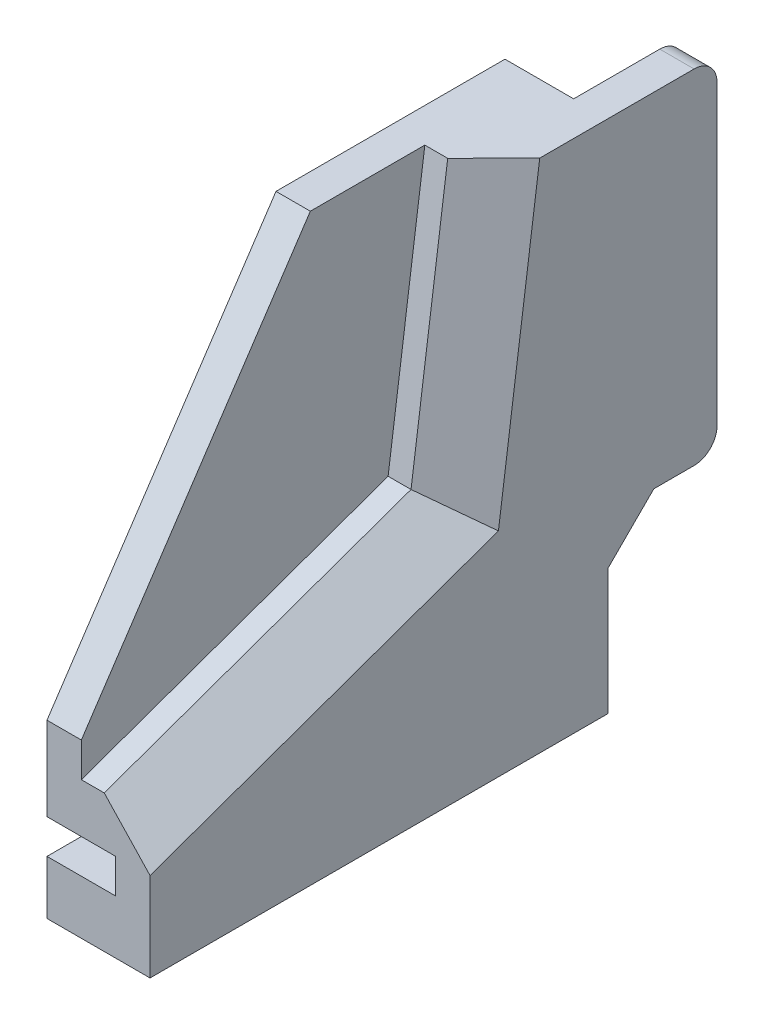
ISO-10303-21;
HEADER;
FILE_DESCRIPTION(('STEP AP214'),'2;1');
FILE_NAME('part.step','',(''),(''),'','','');
FILE_SCHEMA(('AUTOMOTIVE_DESIGN { 1 0 10303 214 1 1 1 1 }'));
ENDSEC;
DATA;
#1=APPLICATION_CONTEXT('core data for automotive mechanical design processes');
#2=APPLICATION_PROTOCOL_DEFINITION('international standard','automotive_design',2000,#1);
#3=PRODUCT_CONTEXT('',#1,'mechanical');
#4=PRODUCT('Part','Part','',(#3));
#5=PRODUCT_RELATED_PRODUCT_CATEGORY('part','',(#4));
#6=PRODUCT_DEFINITION_FORMATION('','',#4);
#7=PRODUCT_DEFINITION_CONTEXT('part definition',#1,'design');
#8=PRODUCT_DEFINITION('design','',#6,#7);
#9=PRODUCT_DEFINITION_SHAPE('','',#8);
#10=(LENGTH_UNIT() NAMED_UNIT(*) SI_UNIT(.MILLI.,.METRE.));
#11=(NAMED_UNIT(*) PLANE_ANGLE_UNIT() SI_UNIT($,.RADIAN.));
#12=(NAMED_UNIT(*) SI_UNIT($,.STERADIAN.) SOLID_ANGLE_UNIT());
#13=UNCERTAINTY_MEASURE_WITH_UNIT(LENGTH_MEASURE(1.E-05),#10,'distance_accuracy_value','');
#14=(GEOMETRIC_REPRESENTATION_CONTEXT(3) GLOBAL_UNCERTAINTY_ASSIGNED_CONTEXT((#13)) GLOBAL_UNIT_ASSIGNED_CONTEXT((#10,
#11,#12)) REPRESENTATION_CONTEXT('',''));
#15=CARTESIAN_POINT('',(0.,0.,0.));
#16=DIRECTION('',(0.,0.,1.));
#17=DIRECTION('',(1.,0.,0.));
#18=AXIS2_PLACEMENT_3D('',#15,#16,#17);
#19=CARTESIAN_POINT('',(0.,0.,0.));
#20=DIRECTION('',(0.,0.,1.));
#21=DIRECTION('',(1.,0.,0.));
#22=AXIS2_PLACEMENT_3D('',#19,#20,#21);
#23=PLANE('',#22);
#24=DIRECTION('',(1.,0.,0.));
#25=VECTOR('',#24,1.);
#26=CARTESIAN_POINT('',(0.,0.,0.));
#27=LINE('',#26,#25);
#28=CARTESIAN_POINT('',(9.,0.,0.));
#29=VERTEX_POINT('',#28);
#30=CARTESIAN_POINT('',(18.,0.,0.));
#31=VERTEX_POINT('',#30);
#32=EDGE_CURVE('E200',#29,#31,#27,.T.);
#33=ORIENTED_EDGE('',*,*,#32,.F.);
#34=DIRECTION('',(0.,1.,0.));
#35=VECTOR('',#34,1.);
#36=CARTESIAN_POINT('',(9.,0.,0.));
#37=LINE('',#36,#35);
#38=CARTESIAN_POINT('',(9.,4.7,0.));
#39=VERTEX_POINT('',#38);
#40=EDGE_CURVE('E230',#29,#39,#37,.T.);
#41=ORIENTED_EDGE('',*,*,#40,.T.);
#42=DIRECTION('',(1.,0.,0.));
#43=VECTOR('',#42,1.);
#44=CARTESIAN_POINT('',(3.,4.7,0.));
#45=LINE('',#44,#43);
#46=CARTESIAN_POINT('',(15.,4.69999999999999,0.));
#47=VERTEX_POINT('',#46);
#48=EDGE_CURVE('E192',#39,#47,#45,.T.);
#49=ORIENTED_EDGE('',*,*,#48,.T.);
#50=DIRECTION('',(0.,1.,0.));
#51=VECTOR('',#50,1.);
#52=CARTESIAN_POINT('',(15.,4.7,0.));
#53=LINE('',#52,#51);
#54=CARTESIAN_POINT('',(15.,7.7,0.));
#55=VERTEX_POINT('',#54);
#56=EDGE_CURVE('E268',#47,#55,#53,.T.);
#57=ORIENTED_EDGE('',*,*,#56,.T.);
#58=DIRECTION('',(1.,0.,0.));
#59=VECTOR('',#58,1.);
#60=CARTESIAN_POINT('',(3.,7.7,0.));
#61=LINE('',#60,#59);
#62=CARTESIAN_POINT('',(9.,7.7,0.));
#63=VERTEX_POINT('',#62);
#64=EDGE_CURVE('E190',#63,#55,#61,.T.);
#65=ORIENTED_EDGE('',*,*,#64,.F.);
#66=CARTESIAN_POINT('',(9.,45.,0.));
#67=VERTEX_POINT('',#66);
#68=EDGE_CURVE('E61',#63,#67,#37,.T.);
#69=ORIENTED_EDGE('',*,*,#68,.T.);
#70=DIRECTION('',(1.,0.,0.));
#71=VECTOR('',#70,1.);
#72=CARTESIAN_POINT('',(0.,45.,0.));
#73=LINE('',#72,#71);
#74=CARTESIAN_POINT('',(15.,45.,0.));
#75=VERTEX_POINT('',#74);
#76=EDGE_CURVE('E199',#67,#75,#73,.T.);
#77=ORIENTED_EDGE('',*,*,#76,.T.);
#78=DIRECTION('',(0.,-1.,0.));
#79=VECTOR('',#78,1.);
#80=CARTESIAN_POINT('',(15.,45.,0.));
#81=LINE('',#80,#79);
#82=CARTESIAN_POINT('',(15.,11.,0.));
#83=VERTEX_POINT('',#82);
#84=EDGE_CURVE('E209',#75,#83,#81,.T.);
#85=ORIENTED_EDGE('',*,*,#84,.T.);
#86=DIRECTION('',(-1.,0.,0.));
#87=VECTOR('',#86,1.);
#88=CARTESIAN_POINT('',(15.,11.,0.));
#89=LINE('',#88,#87);
#90=CARTESIAN_POINT('',(18.,11.,0.));
#91=VERTEX_POINT('',#90);
#92=EDGE_CURVE('E328',#91,#83,#89,.T.);
#93=ORIENTED_EDGE('',*,*,#92,.F.);
#94=DIRECTION('',(0.,1.,0.));
#95=VECTOR('',#94,1.);
#96=CARTESIAN_POINT('',(18.,0.,0.));
#97=LINE('',#96,#95);
#98=EDGE_CURVE('E286',#31,#91,#97,.T.);
#99=ORIENTED_EDGE('',*,*,#98,.F.);
#100=EDGE_LOOP('',(#33,#41,#49,#57,#65,#69,#77,#85,#93,#99));
#101=FACE_BOUND('',#100,.T.);
#102=CARTESIAN_POINT('',(12.,13.,0.));
#103=DIRECTION('',(0.,0.,-1.));
#104=DIRECTION('',(-1.,0.,0.));
#105=AXIS2_PLACEMENT_3D('',#102,#103,#104);
#106=CIRCLE('',#105,1.63195);
#107=CARTESIAN_POINT('',(10.36805,13.,0.));
#108=VERTEX_POINT('',#107);
#109=EDGE_CURVE('E290',#108,#108,#106,.T.);
#110=ORIENTED_EDGE('',*,*,#109,.F.);
#111=EDGE_LOOP('',(#110));
#112=FACE_BOUND('',#111,.T.);
#113=CARTESIAN_POINT('',(12.,25.,0.));
#114=DIRECTION('',(0.,0.,-1.));
#115=DIRECTION('',(-1.,0.,0.));
#116=AXIS2_PLACEMENT_3D('',#113,#114,#115);
#117=CIRCLE('',#116,1.63195);
#118=CARTESIAN_POINT('',(10.36805,25.,0.));
#119=VERTEX_POINT('',#118);
#120=EDGE_CURVE('E287',#119,#119,#117,.T.);
#121=ORIENTED_EDGE('',*,*,#120,.F.);
#122=EDGE_LOOP('',(#121));
#123=FACE_BOUND('',#122,.T.);
#124=ADVANCED_FACE('F38',(#101,#112,#123),#23,.F.);
#125=CARTESIAN_POINT('',(-46.5614587228552,45.,20.));
#126=DIRECTION('',(0.,-0.554700196225229,-0.832050294337844));
#127=DIRECTION('',(0.,0.832050294337844,-0.554700196225229));
#128=AXIS2_PLACEMENT_3D('',#125,#126,#127);
#129=PLANE('',#128);
#130=DIRECTION('',(1.,0.,0.));
#131=VECTOR('',#130,1.);
#132=CARTESIAN_POINT('',(-46.5614587228552,45.,20.));
#133=LINE('',#132,#131);
#134=CARTESIAN_POINT('',(9.,45.,20.));
#135=VERTEX_POINT('',#134);
#136=CARTESIAN_POINT('',(12.,45.,20.));
#137=VERTEX_POINT('',#136);
#138=EDGE_CURVE('E194',#135,#137,#133,.T.);
#139=ORIENTED_EDGE('',*,*,#138,.F.);
#140=DIRECTION('',(0.,-0.832050294337844,0.554700196225229));
#141=VECTOR('',#140,1.);
#142=CARTESIAN_POINT('',(9.,45.,20.));
#143=LINE('',#142,#141);
#144=CARTESIAN_POINT('',(9.,15.,40.));
#145=VERTEX_POINT('',#144);
#146=EDGE_CURVE('E183',#135,#145,#143,.T.);
#147=ORIENTED_EDGE('',*,*,#146,.T.);
#148=DIRECTION('',(1.,0.,0.));
#149=VECTOR('',#148,1.);
#150=CARTESIAN_POINT('',(-46.5614587228552,15.,40.));
#151=LINE('',#150,#149);
#152=CARTESIAN_POINT('',(12.,15.,40.));
#153=VERTEX_POINT('',#152);
#154=EDGE_CURVE('E182',#145,#153,#151,.T.);
#155=ORIENTED_EDGE('',*,*,#154,.T.);
#156=DIRECTION('',(0.,0.832050294337844,-0.554700196225229));
#157=VECTOR('',#156,1.);
#158=CARTESIAN_POINT('',(12.,23.0769230769231,34.6153846153846));
#159=LINE('',#158,#157);
#160=EDGE_CURVE('E258',#153,#137,#159,.T.);
#161=ORIENTED_EDGE('',*,*,#160,.T.);
#162=EDGE_LOOP('',(#139,#147,#155,#161));
#163=FACE_BOUND('',#162,.T.);
#164=ADVANCED_FACE('F411',(#163),#129,.F.);
#165=CARTESIAN_POINT('',(0.,0.,40.));
#166=DIRECTION('',(0.,1.,0.));
#167=DIRECTION('',(0.,0.,1.));
#168=AXIS2_PLACEMENT_3D('',#165,#166,#167);
#169=PLANE('',#168);
#170=DIRECTION('',(1.,0.,0.));
#171=VECTOR('',#170,1.);
#172=CARTESIAN_POINT('',(0.,0.,40.));
#173=LINE('',#172,#171);
#174=CARTESIAN_POINT('',(9.,0.,40.));
#175=VERTEX_POINT('',#174);
#176=CARTESIAN_POINT('',(18.,0.,40.));
#177=VERTEX_POINT('',#176);
#178=EDGE_CURVE('E46',#175,#177,#173,.T.);
#179=ORIENTED_EDGE('',*,*,#178,.F.);
#180=DIRECTION('',(0.,0.,-1.));
#181=VECTOR('',#180,1.);
#182=CARTESIAN_POINT('',(9.,0.,40.));
#183=LINE('',#182,#181);
#184=EDGE_CURVE('E236',#175,#29,#183,.T.);
#185=ORIENTED_EDGE('',*,*,#184,.T.);
#186=ORIENTED_EDGE('',*,*,#32,.T.);
#187=DIRECTION('',(0.,0.,-1.));
#188=VECTOR('',#187,1.);
#189=CARTESIAN_POINT('',(18.,0.,40.));
#190=LINE('',#189,#188);
#191=EDGE_CURVE('E298',#177,#31,#190,.T.);
#192=ORIENTED_EDGE('',*,*,#191,.F.);
#193=EDGE_LOOP('',(#179,#185,#186,#192));
#194=FACE_BOUND('',#193,.T.);
#195=CARTESIAN_POINT('',(12.5,0.,35.));
#196=DIRECTION('',(0.,1.,0.));
#197=DIRECTION('',(0.,0.,-1.));
#198=AXIS2_PLACEMENT_3D('',#195,#196,#197);
#199=CIRCLE('',#198,2.0193);
#200=CARTESIAN_POINT('',(12.5,0.,32.9807));
#201=VERTEX_POINT('',#200);
#202=EDGE_CURVE('E244',#201,#201,#199,.T.);
#203=ORIENTED_EDGE('',*,*,#202,.T.);
#204=EDGE_LOOP('',(#203));
#205=FACE_BOUND('',#204,.T.);
#206=CARTESIAN_POINT('',(12.5,0.,20.));
#207=DIRECTION('',(0.,1.,0.));
#208=DIRECTION('',(0.,0.,-1.));
#209=AXIS2_PLACEMENT_3D('',#206,#207,#208);
#210=CIRCLE('',#209,2.0193);
#211=CARTESIAN_POINT('',(12.5,0.,17.9807));
#212=VERTEX_POINT('',#211);
#213=EDGE_CURVE('E221',#212,#212,#210,.T.);
#214=ORIENTED_EDGE('',*,*,#213,.T.);
#215=EDGE_LOOP('',(#214));
#216=FACE_BOUND('',#215,.T.);
#217=ADVANCED_FACE('F40',(#194,#205,#216),#169,.F.);
#218=CARTESIAN_POINT('',(0.,45.,40.));
#219=DIRECTION('',(0.,1.,0.));
#220=DIRECTION('',(0.,0.,1.));
#221=AXIS2_PLACEMENT_3D('',#218,#219,#220);
#222=PLANE('',#221);
#223=DIRECTION('',(0.,0.,-1.));
#224=VECTOR('',#223,1.);
#225=CARTESIAN_POINT('',(9.,45.,40.));
#226=LINE('',#225,#224);
#227=EDGE_CURVE('E413',#135,#67,#226,.T.);
#228=ORIENTED_EDGE('',*,*,#227,.F.);
#229=ORIENTED_EDGE('',*,*,#138,.T.);
#230=DIRECTION('',(0.,0.,-1.));
#231=VECTOR('',#230,1.);
#232=CARTESIAN_POINT('',(12.,45.,0.));
#233=LINE('',#232,#231);
#234=CARTESIAN_POINT('',(12.,45.,9.99999999999999));
#235=VERTEX_POINT('',#234);
#236=EDGE_CURVE('E261',#137,#235,#233,.T.);
#237=ORIENTED_EDGE('',*,*,#236,.T.);
#238=DIRECTION('',(1.,0.,0.));
#239=VECTOR('',#238,1.);
#240=CARTESIAN_POINT('',(12.,45.,9.99999999999999));
#241=LINE('',#240,#239);
#242=CARTESIAN_POINT('',(14.,45.,9.99999999999999));
#243=VERTEX_POINT('',#242);
#244=EDGE_CURVE('E265',#235,#243,#241,.T.);
#245=ORIENTED_EDGE('',*,*,#244,.T.);
#246=DIRECTION('',(-0.703827457244144,0.,0.710370966769647));
#247=VECTOR('',#246,1.);
#248=CARTESIAN_POINT('',(0.982134621036676,45.,23.1388929479111));
#249=LINE('',#248,#247);
#250=CARTESIAN_POINT('',(18.,45.,5.96281185419435));
#251=VERTEX_POINT('',#250);
#252=EDGE_CURVE('E317',#251,#243,#249,.T.);
#253=ORIENTED_EDGE('',*,*,#252,.F.);
#254=DIRECTION('',(0.,0.,-1.));
#255=VECTOR('',#254,1.);
#256=CARTESIAN_POINT('',(18.,45.,40.));
#257=LINE('',#256,#255);
#258=CARTESIAN_POINT('',(18.,45.,-7.52));
#259=VERTEX_POINT('',#258);
#260=EDGE_CURVE('E303',#251,#259,#257,.T.);
#261=ORIENTED_EDGE('',*,*,#260,.T.);
#262=DIRECTION('',(-1.,0.,0.));
#263=VECTOR('',#262,1.);
#264=CARTESIAN_POINT('',(18.,45.,-7.52));
#265=LINE('',#264,#263);
#266=CARTESIAN_POINT('',(15.,45.,-7.52));
#267=VERTEX_POINT('',#266);
#268=EDGE_CURVE('E218',#267,#259,#265,.F.);
#269=ORIENTED_EDGE('',*,*,#268,.F.);
#270=DIRECTION('',(0.,0.,1.));
#271=VECTOR('',#270,1.);
#272=CARTESIAN_POINT('',(15.,45.,-9.52));
#273=LINE('',#272,#271);
#274=EDGE_CURVE('E214',#267,#75,#273,.T.);
#275=ORIENTED_EDGE('',*,*,#274,.T.);
#276=ORIENTED_EDGE('',*,*,#76,.F.);
#277=EDGE_LOOP('',(#228,#229,#237,#245,#253,#261,#269,#275,#276));
#278=FACE_BOUND('',#277,.T.);
#279=ADVANCED_FACE('F215',(#278),#222,.T.);
#280=CARTESIAN_POINT('',(0.,0.,40.));
#281=DIRECTION('',(0.,0.,1.));
#282=DIRECTION('',(1.,0.,0.));
#283=AXIS2_PLACEMENT_3D('',#280,#281,#282);
#284=PLANE('',#283);
#285=DIRECTION('',(0.,1.,0.));
#286=VECTOR('',#285,1.);
#287=CARTESIAN_POINT('',(9.,0.,40.));
#288=LINE('',#287,#286);
#289=CARTESIAN_POINT('',(9.,4.69999999999999,40.));
#290=VERTEX_POINT('',#289);
#291=EDGE_CURVE('E53',#175,#290,#288,.T.);
#292=ORIENTED_EDGE('',*,*,#291,.F.);
#293=ORIENTED_EDGE('',*,*,#178,.T.);
#294=DIRECTION('',(0.,1.,0.));
#295=VECTOR('',#294,1.);
#296=CARTESIAN_POINT('',(18.,0.,40.));
#297=LINE('',#296,#295);
#298=CARTESIAN_POINT('',(18.,7.75343435574908,40.));
#299=VERTEX_POINT('',#298);
#300=EDGE_CURVE('E295',#177,#299,#297,.T.);
#301=ORIENTED_EDGE('',*,*,#300,.T.);
#302=DIRECTION('',(0.685658452509902,-0.7279234070297,0.));
#303=VECTOR('',#302,1.);
#304=CARTESIAN_POINT('',(21.8697920957097,3.6451028147404,40.));
#305=LINE('',#304,#303);
#306=CARTESIAN_POINT('',(14.,12.,40.));
#307=VERTEX_POINT('',#306);
#308=EDGE_CURVE('E307',#307,#299,#305,.T.);
#309=ORIENTED_EDGE('',*,*,#308,.F.);
#310=DIRECTION('',(1.,0.,0.));
#311=VECTOR('',#310,1.);
#312=CARTESIAN_POINT('',(12.,12.,40.));
#313=LINE('',#312,#311);
#314=CARTESIAN_POINT('',(12.,12.,40.));
#315=VERTEX_POINT('',#314);
#316=EDGE_CURVE('E269',#315,#307,#313,.T.);
#317=ORIENTED_EDGE('',*,*,#316,.F.);
#318=DIRECTION('',(0.,1.,0.));
#319=VECTOR('',#318,1.);
#320=CARTESIAN_POINT('',(12.,0.,40.));
#321=LINE('',#320,#319);
#322=EDGE_CURVE('E256',#315,#153,#321,.T.);
#323=ORIENTED_EDGE('',*,*,#322,.T.);
#324=ORIENTED_EDGE('',*,*,#154,.F.);
#325=CARTESIAN_POINT('',(9.,7.69999999999999,40.));
#326=VERTEX_POINT('',#325);
#327=EDGE_CURVE('E170',#326,#145,#288,.T.);
#328=ORIENTED_EDGE('',*,*,#327,.F.);
#329=DIRECTION('',(1.,0.,0.));
#330=VECTOR('',#329,1.);
#331=CARTESIAN_POINT('',(3.,7.69999999999999,40.));
#332=LINE('',#331,#330);
#333=CARTESIAN_POINT('',(15.,7.69999999999999,40.));
#334=VERTEX_POINT('',#333);
#335=EDGE_CURVE('E179',#326,#334,#332,.T.);
#336=ORIENTED_EDGE('',*,*,#335,.T.);
#337=DIRECTION('',(0.,-1.,0.));
#338=VECTOR('',#337,1.);
#339=CARTESIAN_POINT('',(15.,4.69999999999999,40.));
#340=LINE('',#339,#338);
#341=CARTESIAN_POINT('',(15.,4.69999999999999,40.));
#342=VERTEX_POINT('',#341);
#343=EDGE_CURVE('E277',#334,#342,#340,.T.);
#344=ORIENTED_EDGE('',*,*,#343,.T.);
#345=DIRECTION('',(1.,0.,0.));
#346=VECTOR('',#345,1.);
#347=CARTESIAN_POINT('',(3.,4.69999999999999,40.));
#348=LINE('',#347,#346);
#349=EDGE_CURVE('E189',#290,#342,#348,.T.);
#350=ORIENTED_EDGE('',*,*,#349,.F.);
#351=EDGE_LOOP('',(#292,#293,#301,#309,#317,#323,#324,#328,#336,#344,#350));
#352=FACE_BOUND('',#351,.T.);
#353=ADVANCED_FACE('F177',(#352),#284,.T.);
#354=CARTESIAN_POINT('',(3.,4.7,0.));
#355=DIRECTION('',(0.,-1.,0.));
#356=DIRECTION('',(0.,0.,-1.));
#357=AXIS2_PLACEMENT_3D('',#354,#355,#356);
#358=PLANE('',#357);
#359=ORIENTED_EDGE('',*,*,#48,.F.);
#360=DIRECTION('',(0.,0.,1.));
#361=VECTOR('',#360,1.);
#362=CARTESIAN_POINT('',(9.,4.7,0.));
#363=LINE('',#362,#361);
#364=EDGE_CURVE('E363',#39,#290,#363,.T.);
#365=ORIENTED_EDGE('',*,*,#364,.T.);
#366=ORIENTED_EDGE('',*,*,#349,.T.);
#367=DIRECTION('',(0.,0.,-1.));
#368=VECTOR('',#367,1.);
#369=CARTESIAN_POINT('',(15.,4.7,0.));
#370=LINE('',#369,#368);
#371=EDGE_CURVE('E279',#342,#47,#370,.T.);
#372=ORIENTED_EDGE('',*,*,#371,.T.);
#373=EDGE_LOOP('',(#359,#365,#366,#372));
#374=FACE_BOUND('',#373,.T.);
#375=CARTESIAN_POINT('',(12.5,4.7,35.));
#376=DIRECTION('',(0.,1.,0.));
#377=DIRECTION('',(0.,0.,-1.));
#378=AXIS2_PLACEMENT_3D('',#375,#376,#377);
#379=CIRCLE('',#378,2.0193);
#380=CARTESIAN_POINT('',(12.5,4.7,32.9807));
#381=VERTEX_POINT('',#380);
#382=EDGE_CURVE('E322',#381,#381,#379,.T.);
#383=ORIENTED_EDGE('',*,*,#382,.F.);
#384=EDGE_LOOP('',(#383));
#385=FACE_BOUND('',#384,.T.);
#386=CARTESIAN_POINT('',(12.5,4.7,20.));
#387=DIRECTION('',(0.,1.,0.));
#388=DIRECTION('',(0.,0.,-1.));
#389=AXIS2_PLACEMENT_3D('',#386,#387,#388);
#390=CIRCLE('',#389,2.0193);
#391=CARTESIAN_POINT('',(12.5,4.7,17.9807));
#392=VERTEX_POINT('',#391);
#393=EDGE_CURVE('E247',#392,#392,#390,.T.);
#394=ORIENTED_EDGE('',*,*,#393,.F.);
#395=EDGE_LOOP('',(#394));
#396=FACE_BOUND('',#395,.T.);
#397=ADVANCED_FACE('F356',(#374,#385,#396),#358,.F.);
#398=CARTESIAN_POINT('',(3.,7.7,0.));
#399=DIRECTION('',(0.,1.,0.));
#400=DIRECTION('',(0.,0.,1.));
#401=AXIS2_PLACEMENT_3D('',#398,#399,#400);
#402=PLANE('',#401);
#403=ORIENTED_EDGE('',*,*,#335,.F.);
#404=DIRECTION('',(0.,0.,-1.));
#405=VECTOR('',#404,1.);
#406=CARTESIAN_POINT('',(9.,7.7,0.));
#407=LINE('',#406,#405);
#408=EDGE_CURVE('E11',#326,#63,#407,.T.);
#409=ORIENTED_EDGE('',*,*,#408,.T.);
#410=ORIENTED_EDGE('',*,*,#64,.T.);
#411=DIRECTION('',(0.,0.,1.));
#412=VECTOR('',#411,1.);
#413=CARTESIAN_POINT('',(15.,7.7,0.));
#414=LINE('',#413,#412);
#415=EDGE_CURVE('E187',#55,#334,#414,.T.);
#416=ORIENTED_EDGE('',*,*,#415,.T.);
#417=EDGE_LOOP('',(#403,#409,#410,#416));
#418=FACE_BOUND('',#417,.T.);
#419=ADVANCED_FACE('F185',(#418),#402,.F.);
#420=CARTESIAN_POINT('',(18.,0.,40.));
#421=DIRECTION('',(1.,0.,0.));
#422=DIRECTION('',(0.,0.,1.));
#423=AXIS2_PLACEMENT_3D('',#420,#421,#422);
#424=PLANE('',#423);
#425=DIRECTION('',(0.,1.,0.));
#426=VECTOR('',#425,1.);
#427=CARTESIAN_POINT('',(18.,45.,-9.52));
#428=LINE('',#427,#426);
#429=CARTESIAN_POINT('',(18.,17.,-9.52));
#430=VERTEX_POINT('',#429);
#431=CARTESIAN_POINT('',(18.,43.,-9.52));
#432=VERTEX_POINT('',#431);
#433=EDGE_CURVE('E229',#430,#432,#428,.T.);
#434=ORIENTED_EDGE('',*,*,#433,.T.);
#435=CARTESIAN_POINT('',(18.,43.,-7.52));
#436=DIRECTION('',(-1.,0.,0.));
#437=DIRECTION('',(0.,0.,1.));
#438=AXIS2_PLACEMENT_3D('',#435,#436,#437);
#439=CIRCLE('',#438,2.);
#440=EDGE_CURVE('E337',#259,#432,#439,.T.);
#441=ORIENTED_EDGE('',*,*,#440,.F.);
#442=ORIENTED_EDGE('',*,*,#260,.F.);
#443=DIRECTION('',(0.,0.990788602249246,-0.135417671125244));
#444=VECTOR('',#443,1.);
#445=CARTESIAN_POINT('',(18.,44.458329315499,6.036845591003));
#446=LINE('',#445,#444);
#447=CARTESIAN_POINT('',(18.,18.6009768017821,9.57094201775132));
#448=VERTEX_POINT('',#447);
#449=EDGE_CURVE('E309',#448,#251,#446,.T.);
#450=ORIENTED_EDGE('',*,*,#449,.F.);
#451=DIRECTION('',(0.,0.335787867097437,-0.94193763504287));
#452=VECTOR('',#451,1.);
#453=CARTESIAN_POINT('',(18.,17.7843797198551,11.8616249146116));
#454=LINE('',#453,#452);
#455=EDGE_CURVE('E311',#299,#448,#454,.T.);
#456=ORIENTED_EDGE('',*,*,#455,.F.);
#457=ORIENTED_EDGE('',*,*,#300,.F.);
#458=ORIENTED_EDGE('',*,*,#191,.T.);
#459=ORIENTED_EDGE('',*,*,#98,.T.);
#460=DIRECTION('',(0.,0.707106781186544,-0.707106781186551));
#461=VECTOR('',#460,1.);
#462=CARTESIAN_POINT('',(18.,15.,-4.00000000000001));
#463=LINE('',#462,#461);
#464=CARTESIAN_POINT('',(18.,15.,-4.00000000000001));
#465=VERTEX_POINT('',#464);
#466=EDGE_CURVE('E330',#465,#91,#463,.F.);
#467=ORIENTED_EDGE('',*,*,#466,.F.);
#468=DIRECTION('',(0.,0.,1.));
#469=VECTOR('',#468,1.);
#470=CARTESIAN_POINT('',(18.,15.,-9.52));
#471=LINE('',#470,#469);
#472=CARTESIAN_POINT('',(18.,15.,-7.52));
#473=VERTEX_POINT('',#472);
#474=EDGE_CURVE('E240',#473,#465,#471,.T.);
#475=ORIENTED_EDGE('',*,*,#474,.F.);
#476=CARTESIAN_POINT('',(18.,17.,-7.52));
#477=DIRECTION('',(-1.,0.,0.));
#478=DIRECTION('',(0.,0.,1.));
#479=AXIS2_PLACEMENT_3D('',#476,#477,#478);
#480=CIRCLE('',#479,2.);
#481=EDGE_CURVE('E340',#430,#473,#480,.T.);
#482=ORIENTED_EDGE('',*,*,#481,.F.);
#483=EDGE_LOOP('',(#434,#441,#442,#450,#456,#457,#458,#459,#467,#475,#482));
#484=FACE_BOUND('',#483,.T.);
#485=ADVANCED_FACE('F370',(#484),#424,.T.);
#486=CARTESIAN_POINT('',(12.,13.,10.));
#487=DIRECTION('',(0.,0.,-1.));
#488=DIRECTION('',(1.,0.,0.));
#489=AXIS2_PLACEMENT_3D('',#486,#487,#488);
#490=CYLINDRICAL_SURFACE('',#489,1.63195);
#491=CARTESIAN_POINT('',(12.,13.,10.));
#492=DIRECTION('',(0.,0.,-1.));
#493=DIRECTION('',(-1.,0.,0.));
#494=AXIS2_PLACEMENT_3D('',#491,#492,#493);
#495=CIRCLE('',#494,1.63195);
#496=CARTESIAN_POINT('',(10.36805,13.,10.));
#497=VERTEX_POINT('',#496);
#498=EDGE_CURVE('E282',#497,#497,#495,.T.);
#499=ORIENTED_EDGE('',*,*,#498,.F.);
#500=EDGE_LOOP('',(#499));
#501=FACE_BOUND('',#500,.T.);
#502=ORIENTED_EDGE('',*,*,#109,.T.);
#503=EDGE_LOOP('',(#502));
#504=FACE_BOUND('',#503,.T.);
#505=ADVANCED_FACE('F644',(#501,#504),#490,.F.);
#506=CARTESIAN_POINT('',(12.,13.,10.));
#507=DIRECTION('',(0.,0.,1.));
#508=DIRECTION('',(-1.,0.,0.));
#509=AXIS2_PLACEMENT_3D('',#506,#507,#508);
#510=PLANE('',#509);
#511=ORIENTED_EDGE('',*,*,#498,.T.);
#512=EDGE_LOOP('',(#511));
#513=FACE_BOUND('',#512,.T.);
#514=ADVANCED_FACE('F635',(#513),#510,.F.);
#515=CARTESIAN_POINT('',(12.,25.,10.));
#516=DIRECTION('',(0.,0.,-1.));
#517=DIRECTION('',(1.,0.,0.));
#518=AXIS2_PLACEMENT_3D('',#515,#516,#517);
#519=CYLINDRICAL_SURFACE('',#518,1.63195);
#520=CARTESIAN_POINT('',(12.,25.,10.));
#521=DIRECTION('',(0.,0.,-1.));
#522=DIRECTION('',(-1.,0.,0.));
#523=AXIS2_PLACEMENT_3D('',#520,#521,#522);
#524=CIRCLE('',#523,1.63195);
#525=CARTESIAN_POINT('',(10.36805,25.,10.));
#526=VERTEX_POINT('',#525);
#527=EDGE_CURVE('E283',#526,#526,#524,.T.);
#528=ORIENTED_EDGE('',*,*,#527,.F.);
#529=EDGE_LOOP('',(#528));
#530=FACE_BOUND('',#529,.T.);
#531=ORIENTED_EDGE('',*,*,#120,.T.);
#532=EDGE_LOOP('',(#531));
#533=FACE_BOUND('',#532,.T.);
#534=ADVANCED_FACE('F626',(#530,#533),#519,.F.);
#535=CARTESIAN_POINT('',(18.,0.,10.));
#536=DIRECTION('',(0.,0.,1.));
#537=DIRECTION('',(-1.,0.,0.));
#538=AXIS2_PLACEMENT_3D('',#535,#536,#537);
#539=PLANE('',#538);
#540=ORIENTED_EDGE('',*,*,#527,.T.);
#541=EDGE_LOOP('',(#540));
#542=FACE_BOUND('',#541,.T.);
#543=ADVANCED_FACE('F618',(#542),#539,.F.);
#544=CARTESIAN_POINT('',(15.,0.,0.));
#545=DIRECTION('',(-1.,0.,0.));
#546=DIRECTION('',(0.,0.,-1.));
#547=AXIS2_PLACEMENT_3D('',#544,#545,#546);
#548=PLANE('',#547);
#549=ORIENTED_EDGE('',*,*,#56,.F.);
#550=ORIENTED_EDGE('',*,*,#371,.F.);
#551=ORIENTED_EDGE('',*,*,#343,.F.);
#552=ORIENTED_EDGE('',*,*,#415,.F.);
#553=EDGE_LOOP('',(#549,#550,#551,#552));
#554=FACE_BOUND('',#553,.T.);
#555=ADVANCED_FACE('F360',(#554),#548,.T.);
#556=CARTESIAN_POINT('',(12.,2.1669104053246,15.8542833727014));
#557=DIRECTION('',(0.,-0.135417671125244,-0.990788602249246));
#558=DIRECTION('',(0.,0.990788602249246,-0.135417671125244));
#559=AXIS2_PLACEMENT_3D('',#556,#557,#558);
#560=PLANE('',#559);
#561=ORIENTED_EDGE('',*,*,#244,.F.);
#562=DIRECTION('',(0.,-0.990788602249246,0.135417671125244));
#563=VECTOR('',#562,1.);
#564=CARTESIAN_POINT('',(12.,2.1669104053246,15.8542833727014));
#565=LINE('',#564,#563);
#566=CARTESIAN_POINT('',(12.,21.5521302600266,13.2047763830013));
#567=VERTEX_POINT('',#566);
#568=EDGE_CURVE('E250',#235,#567,#565,.T.);
#569=ORIENTED_EDGE('',*,*,#568,.T.);
#570=DIRECTION('',(1.,0.,0.));
#571=VECTOR('',#570,1.);
#572=CARTESIAN_POINT('',(12.,21.5521302600266,13.2047763830013));
#573=LINE('',#572,#571);
#574=CARTESIAN_POINT('',(14.,21.5521302600266,13.2047763830013));
#575=VERTEX_POINT('',#574);
#576=EDGE_CURVE('E264',#567,#575,#573,.T.);
#577=ORIENTED_EDGE('',*,*,#576,.T.);
#578=DIRECTION('',(0.,-0.990788602249246,0.135417671125244));
#579=VECTOR('',#578,1.);
#580=CARTESIAN_POINT('',(14.,21.5521302600266,13.2047763830013));
#581=LINE('',#580,#579);
#582=EDGE_CURVE('E314',#243,#575,#581,.T.);
#583=ORIENTED_EDGE('',*,*,#582,.F.);
#584=EDGE_LOOP('',(#561,#569,#577,#583));
#585=FACE_BOUND('',#584,.T.);
#586=ADVANCED_FACE('F602',(#585),#560,.F.);
#587=CARTESIAN_POINT('',(12.,23.2986072761158,8.30563442051202));
#588=DIRECTION('',(0.,-0.94193763504287,-0.335787867097437));
#589=DIRECTION('',(0.,0.335787867097437,-0.94193763504287));
#590=AXIS2_PLACEMENT_3D('',#587,#588,#589);
#591=PLANE('',#590);
#592=ORIENTED_EDGE('',*,*,#576,.F.);
#593=DIRECTION('',(0.,-0.335787867097437,0.94193763504287));
#594=VECTOR('',#593,1.);
#595=CARTESIAN_POINT('',(12.,23.2986072761158,8.30563442051202));
#596=LINE('',#595,#594);
#597=EDGE_CURVE('E253',#567,#315,#596,.T.);
#598=ORIENTED_EDGE('',*,*,#597,.T.);
#599=ORIENTED_EDGE('',*,*,#316,.T.);
#600=DIRECTION('',(0.,-0.335787867097437,0.94193763504287));
#601=VECTOR('',#600,1.);
#602=CARTESIAN_POINT('',(14.,12.,40.));
#603=LINE('',#602,#601);
#604=EDGE_CURVE('E305',#575,#307,#603,.T.);
#605=ORIENTED_EDGE('',*,*,#604,.F.);
#606=EDGE_LOOP('',(#592,#598,#599,#605));
#607=FACE_BOUND('',#606,.T.);
#608=ADVANCED_FACE('F403',(#607),#591,.F.);
#609=CARTESIAN_POINT('',(12.,0.,0.));
#610=DIRECTION('',(1.,0.,0.));
#611=DIRECTION('',(0.,0.,1.));
#612=AXIS2_PLACEMENT_3D('',#609,#610,#611);
#613=PLANE('',#612);
#614=ORIENTED_EDGE('',*,*,#568,.F.);
#615=ORIENTED_EDGE('',*,*,#236,.F.);
#616=ORIENTED_EDGE('',*,*,#160,.F.);
#617=ORIENTED_EDGE('',*,*,#322,.F.);
#618=ORIENTED_EDGE('',*,*,#597,.F.);
#619=EDGE_LOOP('',(#614,#615,#616,#617,#618));
#620=FACE_BOUND('',#619,.T.);
#621=ADVANCED_FACE('F407',(#620),#613,.T.);
#622=CARTESIAN_POINT('',(14.,2.1669104053246,15.8542833727014));
#623=DIRECTION('',(0.707106781186548,0.0957547535451497,0.700593339372783));
#624=DIRECTION('',(0.,0.990788602249246,-0.135417671125244));
#625=AXIS2_PLACEMENT_3D('',#622,#623,#624);
#626=PLANE('',#625);
#627=ORIENTED_EDGE('',*,*,#252,.T.);
#628=ORIENTED_EDGE('',*,*,#582,.T.);
#629=DIRECTION('',(-0.649620693737706,0.479282589217794,0.590153500320407));
#630=VECTOR('',#629,1.);
#631=CARTESIAN_POINT('',(15.3344441714052,20.5675928772074,11.9924891108614));
#632=LINE('',#631,#630);
#633=EDGE_CURVE('E254',#575,#448,#632,.F.);
#634=ORIENTED_EDGE('',*,*,#633,.T.);
#635=ORIENTED_EDGE('',*,*,#449,.T.);
#636=EDGE_LOOP('',(#627,#628,#634,#635));
#637=FACE_BOUND('',#636,.T.);
#638=ADVANCED_FACE('F395',(#637),#626,.T.);
#639=CARTESIAN_POINT('',(14.,23.2986072761158,8.30563442051202));
#640=DIRECTION('',(0.707106781186549,0.666050489193631,0.237437877864764));
#641=DIRECTION('',(0.,0.335787867097437,-0.94193763504287));
#642=AXIS2_PLACEMENT_3D('',#639,#640,#641);
#643=PLANE('',#642);
#644=ORIENTED_EDGE('',*,*,#633,.F.);
#645=ORIENTED_EDGE('',*,*,#604,.T.);
#646=ORIENTED_EDGE('',*,*,#308,.T.);
#647=ORIENTED_EDGE('',*,*,#455,.T.);
#648=EDGE_LOOP('',(#644,#645,#646,#647));
#649=FACE_BOUND('',#648,.T.);
#650=ADVANCED_FACE('F397',(#649),#643,.T.);
#651=CARTESIAN_POINT('',(12.5,6.,20.));
#652=DIRECTION('',(0.,-1.,0.));
#653=DIRECTION('',(0.,0.,-1.));
#654=AXIS2_PLACEMENT_3D('',#651,#652,#653);
#655=CYLINDRICAL_SURFACE('',#654,2.0193);
#656=ORIENTED_EDGE('',*,*,#213,.F.);
#657=EDGE_LOOP('',(#656));
#658=FACE_BOUND('',#657,.T.);
#659=ORIENTED_EDGE('',*,*,#393,.T.);
#660=EDGE_LOOP('',(#659));
#661=FACE_BOUND('',#660,.T.);
#662=ADVANCED_FACE('F564',(#658,#661),#655,.F.);
#663=CARTESIAN_POINT('',(12.5,6.,35.));
#664=DIRECTION('',(0.,-1.,0.));
#665=DIRECTION('',(0.,0.,-1.));
#666=AXIS2_PLACEMENT_3D('',#663,#664,#665);
#667=CYLINDRICAL_SURFACE('',#666,2.0193);
#668=ORIENTED_EDGE('',*,*,#202,.F.);
#669=EDGE_LOOP('',(#668));
#670=FACE_BOUND('',#669,.T.);
#671=ORIENTED_EDGE('',*,*,#382,.T.);
#672=EDGE_LOOP('',(#671));
#673=FACE_BOUND('',#672,.T.);
#674=ADVANCED_FACE('F556',(#670,#673),#667,.F.);
#675=CARTESIAN_POINT('',(15.,45.,-9.52));
#676=DIRECTION('',(1.,0.,0.));
#677=DIRECTION('',(0.,-1.,0.));
#678=AXIS2_PLACEMENT_3D('',#675,#676,#677);
#679=PLANE('',#678);
#680=DIRECTION('',(0.,0.,1.));
#681=VECTOR('',#680,1.);
#682=CARTESIAN_POINT('',(15.,15.,-9.52));
#683=LINE('',#682,#681);
#684=CARTESIAN_POINT('',(15.,15.,-7.52));
#685=VERTEX_POINT('',#684);
#686=CARTESIAN_POINT('',(15.,15.,-4.00000000000001));
#687=VERTEX_POINT('',#686);
#688=EDGE_CURVE('E222',#685,#687,#683,.T.);
#689=ORIENTED_EDGE('',*,*,#688,.T.);
#690=DIRECTION('',(0.,-0.707106781186544,0.707106781186551));
#691=VECTOR('',#690,1.);
#692=CARTESIAN_POINT('',(15.,32.7599999999999,-21.76));
#693=LINE('',#692,#691);
#694=EDGE_CURVE('E227',#83,#687,#693,.F.);
#695=ORIENTED_EDGE('',*,*,#694,.F.);
#696=ORIENTED_EDGE('',*,*,#84,.F.);
#697=ORIENTED_EDGE('',*,*,#274,.F.);
#698=CARTESIAN_POINT('',(15.,43.,-7.52));
#699=DIRECTION('',(-1.,0.,0.));
#700=DIRECTION('',(0.,-1.,0.));
#701=AXIS2_PLACEMENT_3D('',#698,#699,#700);
#702=CIRCLE('',#701,2.);
#703=CARTESIAN_POINT('',(15.,43.,-9.52));
#704=VERTEX_POINT('',#703);
#705=EDGE_CURVE('E345',#704,#267,#702,.F.);
#706=ORIENTED_EDGE('',*,*,#705,.F.);
#707=DIRECTION('',(0.,-1.,0.));
#708=VECTOR('',#707,1.);
#709=CARTESIAN_POINT('',(15.,45.,-9.52));
#710=LINE('',#709,#708);
#711=CARTESIAN_POINT('',(15.,17.,-9.52));
#712=VERTEX_POINT('',#711);
#713=EDGE_CURVE('E233',#704,#712,#710,.T.);
#714=ORIENTED_EDGE('',*,*,#713,.T.);
#715=CARTESIAN_POINT('',(15.,17.,-7.52));
#716=DIRECTION('',(-1.,0.,0.));
#717=DIRECTION('',(0.,-1.,0.));
#718=AXIS2_PLACEMENT_3D('',#715,#716,#717);
#719=CIRCLE('',#718,2.);
#720=EDGE_CURVE('E347',#685,#712,#719,.F.);
#721=ORIENTED_EDGE('',*,*,#720,.F.);
#722=EDGE_LOOP('',(#689,#695,#696,#697,#706,#714,#721));
#723=FACE_BOUND('',#722,.T.);
#724=ADVANCED_FACE('F225',(#723),#679,.F.);
#725=CARTESIAN_POINT('',(18.,15.,-9.52));
#726=DIRECTION('',(0.,1.,0.));
#727=DIRECTION('',(0.,0.,1.));
#728=AXIS2_PLACEMENT_3D('',#725,#726,#727);
#729=PLANE('',#728);
#730=ORIENTED_EDGE('',*,*,#474,.T.);
#731=DIRECTION('',(1.,0.,0.));
#732=VECTOR('',#731,1.);
#733=CARTESIAN_POINT('',(18.,15.,-4.00000000000001));
#734=LINE('',#733,#732);
#735=EDGE_CURVE('E320',#687,#465,#734,.T.);
#736=ORIENTED_EDGE('',*,*,#735,.F.);
#737=ORIENTED_EDGE('',*,*,#688,.F.);
#738=DIRECTION('',(1.,0.,0.));
#739=VECTOR('',#738,1.);
#740=CARTESIAN_POINT('',(18.,15.,-7.52));
#741=LINE('',#740,#739);
#742=EDGE_CURVE('E343',#473,#685,#741,.F.);
#743=ORIENTED_EDGE('',*,*,#742,.F.);
#744=EDGE_LOOP('',(#730,#736,#737,#743));
#745=FACE_BOUND('',#744,.T.);
#746=ADVANCED_FACE('F379',(#745),#729,.F.);
#747=CARTESIAN_POINT('',(18.,0.,-9.52));
#748=DIRECTION('',(0.,0.,1.));
#749=DIRECTION('',(-1.,0.,0.));
#750=AXIS2_PLACEMENT_3D('',#747,#748,#749);
#751=PLANE('',#750);
#752=ORIENTED_EDGE('',*,*,#713,.F.);
#753=DIRECTION('',(-1.,0.,0.));
#754=VECTOR('',#753,1.);
#755=CARTESIAN_POINT('',(15.,43.,-9.52));
#756=LINE('',#755,#754);
#757=EDGE_CURVE('E333',#432,#704,#756,.T.);
#758=ORIENTED_EDGE('',*,*,#757,.F.);
#759=ORIENTED_EDGE('',*,*,#433,.F.);
#760=DIRECTION('',(1.,0.,0.));
#761=VECTOR('',#760,1.);
#762=CARTESIAN_POINT('',(18.,17.,-9.52));
#763=LINE('',#762,#761);
#764=EDGE_CURVE('E335',#712,#430,#763,.T.);
#765=ORIENTED_EDGE('',*,*,#764,.F.);
#766=EDGE_LOOP('',(#752,#758,#759,#765));
#767=FACE_BOUND('',#766,.T.);
#768=ADVANCED_FACE('F387',(#767),#751,.F.);
#769=CARTESIAN_POINT('',(18.,15.,-4.00000000000001));
#770=DIRECTION('',(0.,-0.707106781186551,-0.707106781186544));
#771=DIRECTION('',(-1.,0.,0.));
#772=AXIS2_PLACEMENT_3D('',#769,#770,#771);
#773=PLANE('',#772);
#774=ORIENTED_EDGE('',*,*,#694,.T.);
#775=ORIENTED_EDGE('',*,*,#735,.T.);
#776=ORIENTED_EDGE('',*,*,#466,.T.);
#777=ORIENTED_EDGE('',*,*,#92,.T.);
#778=EDGE_LOOP('',(#774,#775,#776,#777));
#779=FACE_BOUND('',#778,.T.);
#780=ADVANCED_FACE('F374',(#779),#773,.T.);
#781=CARTESIAN_POINT('',(18.,17.,-7.52));
#782=DIRECTION('',(1.,0.,0.));
#783=DIRECTION('',(0.,0.,1.));
#784=AXIS2_PLACEMENT_3D('',#781,#782,#783);
#785=CYLINDRICAL_SURFACE('',#784,2.);
#786=ORIENTED_EDGE('',*,*,#720,.T.);
#787=ORIENTED_EDGE('',*,*,#764,.T.);
#788=ORIENTED_EDGE('',*,*,#481,.T.);
#789=ORIENTED_EDGE('',*,*,#742,.T.);
#790=EDGE_LOOP('',(#786,#787,#788,#789));
#791=FACE_BOUND('',#790,.T.);
#792=ADVANCED_FACE('F383',(#791),#785,.T.);
#793=CARTESIAN_POINT('',(18.,43.,-7.52));
#794=DIRECTION('',(1.,0.,0.));
#795=DIRECTION('',(0.,0.,1.));
#796=AXIS2_PLACEMENT_3D('',#793,#794,#795);
#797=CYLINDRICAL_SURFACE('',#796,2.);
#798=ORIENTED_EDGE('',*,*,#440,.T.);
#799=ORIENTED_EDGE('',*,*,#757,.T.);
#800=ORIENTED_EDGE('',*,*,#705,.T.);
#801=ORIENTED_EDGE('',*,*,#268,.T.);
#802=EDGE_LOOP('',(#798,#799,#800,#801));
#803=FACE_BOUND('',#802,.T.);
#804=ADVANCED_FACE('F392',(#803),#797,.T.);
#805=CARTESIAN_POINT('',(9.,0.,0.));
#806=DIRECTION('',(1.,0.,0.));
#807=DIRECTION('',(0.,0.,-1.));
#808=AXIS2_PLACEMENT_3D('',#805,#806,#807);
#809=PLANE('',#808);
#810=ORIENTED_EDGE('',*,*,#227,.T.);
#811=ORIENTED_EDGE('',*,*,#68,.F.);
#812=ORIENTED_EDGE('',*,*,#408,.F.);
#813=ORIENTED_EDGE('',*,*,#327,.T.);
#814=ORIENTED_EDGE('',*,*,#146,.F.);
#815=EDGE_LOOP('',(#810,#811,#812,#813,#814));
#816=FACE_BOUND('',#815,.T.);
#817=ADVANCED_FACE('F169',(#816),#809,.F.);
#818=ORIENTED_EDGE('',*,*,#184,.F.);
#819=ORIENTED_EDGE('',*,*,#291,.T.);
#820=ORIENTED_EDGE('',*,*,#364,.F.);
#821=ORIENTED_EDGE('',*,*,#40,.F.);
#822=EDGE_LOOP('',(#818,#819,#820,#821));
#823=FACE_BOUND('',#822,.T.);
#824=ADVANCED_FACE('F417',(#823),#809,.F.);
#825=CLOSED_SHELL('',(#124,#164,#217,#279,#353,#397,#419,#485,#505,#514,#534,#543,#555,#586,
#608,#621,#638,#650,#662,#674,#724,#746,#768,#780,#792,#804,#817,#824));
#826=MANIFOLD_SOLID_BREP('B2',#825);
#827=ADVANCED_BREP_SHAPE_REPRESENTATION('',(#18,#826),#14);
#828=SHAPE_DEFINITION_REPRESENTATION(#9,#827);
ENDSEC;
END-ISO-10303-21;
